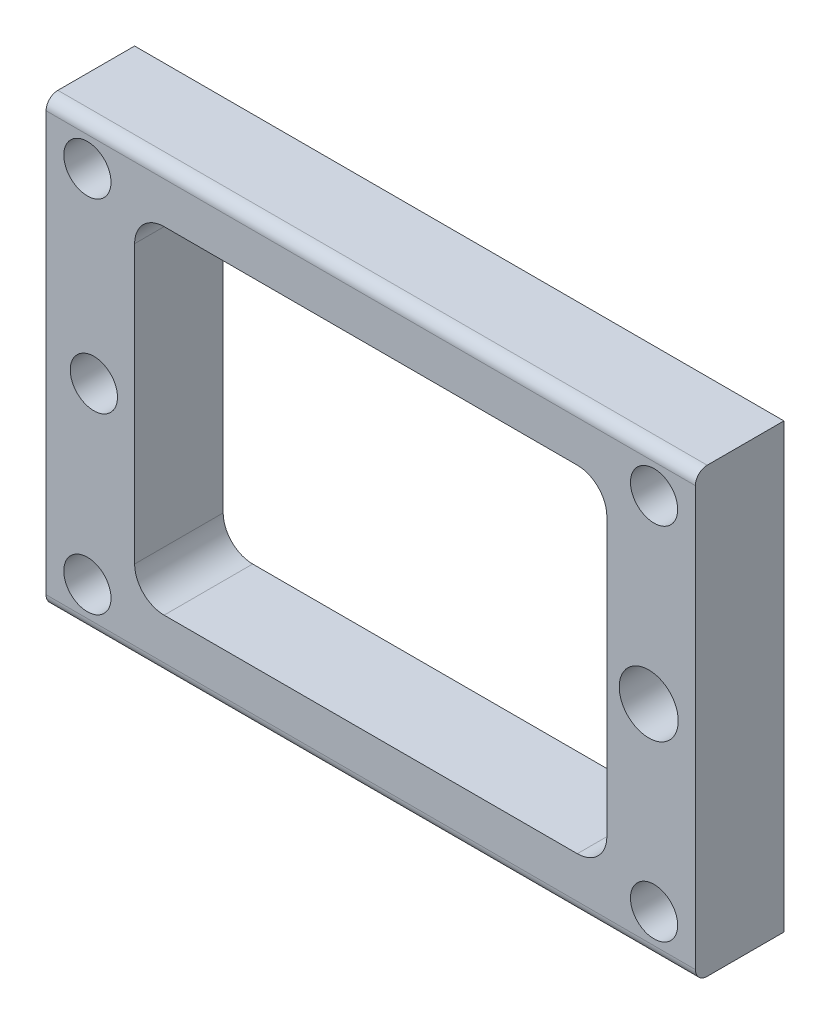
ISO-10303-21;
HEADER;
FILE_DESCRIPTION(('STEP AP214'),'2;1');
FILE_NAME('part.step','',(''),(''),'','','');
FILE_SCHEMA(('AUTOMOTIVE_DESIGN { 1 0 10303 214 1 1 1 1 }'));
ENDSEC;
DATA;
#1=APPLICATION_CONTEXT('core data for automotive mechanical design processes');
#2=APPLICATION_PROTOCOL_DEFINITION('international standard','automotive_design',2000,#1);
#3=PRODUCT_CONTEXT('',#1,'mechanical');
#4=PRODUCT('Part','Part','',(#3));
#5=PRODUCT_RELATED_PRODUCT_CATEGORY('part','',(#4));
#6=PRODUCT_DEFINITION_FORMATION('','',#4);
#7=PRODUCT_DEFINITION_CONTEXT('part definition',#1,'design');
#8=PRODUCT_DEFINITION('design','',#6,#7);
#9=PRODUCT_DEFINITION_SHAPE('','',#8);
#10=(LENGTH_UNIT() NAMED_UNIT(*) SI_UNIT(.MILLI.,.METRE.));
#11=(NAMED_UNIT(*) PLANE_ANGLE_UNIT() SI_UNIT($,.RADIAN.));
#12=(NAMED_UNIT(*) SI_UNIT($,.STERADIAN.) SOLID_ANGLE_UNIT());
#13=UNCERTAINTY_MEASURE_WITH_UNIT(LENGTH_MEASURE(1.E-05),#10,'distance_accuracy_value','');
#14=(GEOMETRIC_REPRESENTATION_CONTEXT(3) GLOBAL_UNCERTAINTY_ASSIGNED_CONTEXT((#13)) GLOBAL_UNIT_ASSIGNED_CONTEXT((#10,
#11,#12)) REPRESENTATION_CONTEXT('',''));
#15=CARTESIAN_POINT('',(0.,0.,0.));
#16=DIRECTION('',(0.,0.,1.));
#17=DIRECTION('',(1.,0.,0.));
#18=AXIS2_PLACEMENT_3D('',#15,#16,#17);
#19=CARTESIAN_POINT('',(-645.862272549346,927.057366956166,15.));
#20=DIRECTION('',(0.,0.,-1.));
#21=DIRECTION('',(-1.,0.,0.));
#22=AXIS2_PLACEMENT_3D('',#19,#20,#21);
#23=CYLINDRICAL_SURFACE('',#22,1.99751610699502);
#24=CARTESIAN_POINT('',(-645.862272549346,927.057366956166,0.));
#25=DIRECTION('',(0.,0.,1.));
#26=DIRECTION('',(1.,0.,0.));
#27=AXIS2_PLACEMENT_3D('',#24,#25,#26);
#28=CIRCLE('',#27,1.99751610699502);
#29=CARTESIAN_POINT('',(-643.864756442351,927.057366956166,0.));
#30=VERTEX_POINT('',#29);
#31=EDGE_CURVE('E223',#30,#30,#28,.T.);
#32=ORIENTED_EDGE('',*,*,#31,.F.);
#33=EDGE_LOOP('',(#32));
#34=FACE_BOUND('',#33,.T.);
#35=CARTESIAN_POINT('',(-645.862272549346,927.057366956166,9.));
#36=DIRECTION('',(0.,0.,1.));
#37=DIRECTION('',(1.,0.,0.));
#38=AXIS2_PLACEMENT_3D('',#35,#36,#37);
#39=CIRCLE('',#38,1.99751610699502);
#40=CARTESIAN_POINT('',(-643.864756442351,927.057366956166,9.));
#41=VERTEX_POINT('',#40);
#42=EDGE_CURVE('E197',#41,#41,#39,.T.);
#43=ORIENTED_EDGE('',*,*,#42,.T.);
#44=EDGE_LOOP('',(#43));
#45=FACE_BOUND('',#44,.T.);
#46=ADVANCED_FACE('F43',(#34,#45),#23,.F.);
#47=CARTESIAN_POINT('',(-741.862272549346,927.057366956166,15.));
#48=DIRECTION('',(0.,0.,-1.));
#49=DIRECTION('',(-1.,0.,0.));
#50=AXIS2_PLACEMENT_3D('',#47,#48,#49);
#51=CYLINDRICAL_SURFACE('',#50,2.);
#52=CARTESIAN_POINT('',(-741.862272549346,927.057366956166,0.));
#53=DIRECTION('',(0.,0.,1.));
#54=DIRECTION('',(1.,0.,0.));
#55=AXIS2_PLACEMENT_3D('',#52,#53,#54);
#56=CIRCLE('',#55,2.);
#57=CARTESIAN_POINT('',(-739.862272549346,927.057366956166,0.));
#58=VERTEX_POINT('',#57);
#59=EDGE_CURVE('E225',#58,#58,#56,.T.);
#60=ORIENTED_EDGE('',*,*,#59,.F.);
#61=EDGE_LOOP('',(#60));
#62=FACE_BOUND('',#61,.T.);
#63=CARTESIAN_POINT('',(-741.862272549346,927.057366956166,9.));
#64=DIRECTION('',(0.,0.,1.));
#65=DIRECTION('',(1.,0.,0.));
#66=AXIS2_PLACEMENT_3D('',#63,#64,#65);
#67=CIRCLE('',#66,2.);
#68=CARTESIAN_POINT('',(-739.862272549346,927.057366956166,9.));
#69=VERTEX_POINT('',#68);
#70=EDGE_CURVE('E270',#69,#69,#67,.T.);
#71=ORIENTED_EDGE('',*,*,#70,.T.);
#72=EDGE_LOOP('',(#71));
#73=FACE_BOUND('',#72,.T.);
#74=ADVANCED_FACE('F312',(#62,#73),#51,.F.);
#75=CARTESIAN_POINT('',(-741.862272549346,866.057366956166,15.));
#76=DIRECTION('',(0.,0.,-1.));
#77=DIRECTION('',(-1.,0.,0.));
#78=AXIS2_PLACEMENT_3D('',#75,#76,#77);
#79=CYLINDRICAL_SURFACE('',#78,2.);
#80=CARTESIAN_POINT('',(-741.862272549346,866.057366956166,0.));
#81=DIRECTION('',(0.,0.,1.));
#82=DIRECTION('',(1.,0.,0.));
#83=AXIS2_PLACEMENT_3D('',#80,#81,#82);
#84=CIRCLE('',#83,2.);
#85=CARTESIAN_POINT('',(-739.862272549346,866.057366956166,0.));
#86=VERTEX_POINT('',#85);
#87=EDGE_CURVE('E218',#86,#86,#84,.T.);
#88=ORIENTED_EDGE('',*,*,#87,.F.);
#89=EDGE_LOOP('',(#88));
#90=FACE_BOUND('',#89,.T.);
#91=CARTESIAN_POINT('',(-741.862272549346,866.057366956166,9.));
#92=DIRECTION('',(0.,0.,1.));
#93=DIRECTION('',(1.,0.,0.));
#94=AXIS2_PLACEMENT_3D('',#91,#92,#93);
#95=CIRCLE('',#94,2.);
#96=CARTESIAN_POINT('',(-739.862272549346,866.057366956166,9.));
#97=VERTEX_POINT('',#96);
#98=EDGE_CURVE('E263',#97,#97,#95,.T.);
#99=ORIENTED_EDGE('',*,*,#98,.T.);
#100=EDGE_LOOP('',(#99));
#101=FACE_BOUND('',#100,.T.);
#102=ADVANCED_FACE('F325',(#90,#101),#79,.F.);
#103=CARTESIAN_POINT('',(-645.862272549346,866.057366956166,15.));
#104=DIRECTION('',(0.,0.,-1.));
#105=DIRECTION('',(-1.,0.,0.));
#106=AXIS2_PLACEMENT_3D('',#103,#104,#105);
#107=CYLINDRICAL_SURFACE('',#106,2.);
#108=CARTESIAN_POINT('',(-645.862272549346,866.057366956166,0.));
#109=DIRECTION('',(0.,0.,1.));
#110=DIRECTION('',(1.,0.,0.));
#111=AXIS2_PLACEMENT_3D('',#108,#109,#110);
#112=CIRCLE('',#111,2.);
#113=CARTESIAN_POINT('',(-643.862272549346,866.057366956166,0.));
#114=VERTEX_POINT('',#113);
#115=EDGE_CURVE('E216',#114,#114,#112,.T.);
#116=ORIENTED_EDGE('',*,*,#115,.F.);
#117=EDGE_LOOP('',(#116));
#118=FACE_BOUND('',#117,.T.);
#119=CARTESIAN_POINT('',(-645.862272549346,866.057366956166,9.));
#120=DIRECTION('',(0.,0.,1.));
#121=DIRECTION('',(1.,0.,0.));
#122=AXIS2_PLACEMENT_3D('',#119,#120,#121);
#123=CIRCLE('',#122,2.);
#124=CARTESIAN_POINT('',(-643.862272549346,866.057366956166,9.));
#125=VERTEX_POINT('',#124);
#126=EDGE_CURVE('E257',#125,#125,#123,.T.);
#127=ORIENTED_EDGE('',*,*,#126,.T.);
#128=EDGE_LOOP('',(#127));
#129=FACE_BOUND('',#128,.T.);
#130=ADVANCED_FACE('F315',(#118,#129),#107,.F.);
#131=CARTESIAN_POINT('',(-748.862272549346,0.,15.));
#132=DIRECTION('',(1.,0.,0.));
#133=DIRECTION('',(0.,0.,-1.));
#134=AXIS2_PLACEMENT_3D('',#131,#132,#133);
#135=PLANE('',#134);
#136=DIRECTION('',(0.,-1.,0.));
#137=VECTOR('',#136,1.);
#138=CARTESIAN_POINT('',(-748.862272549346,0.,15.));
#139=LINE('',#138,#137);
#140=CARTESIAN_POINT('',(-748.862272549346,932.057366956166,15.));
#141=VERTEX_POINT('',#140);
#142=CARTESIAN_POINT('',(-748.862272549346,861.057366956166,15.));
#143=VERTEX_POINT('',#142);
#144=EDGE_CURVE('E188',#141,#143,#139,.T.);
#145=ORIENTED_EDGE('',*,*,#144,.F.);
#146=CARTESIAN_POINT('',(-748.862272549346,932.057366956166,13.));
#147=DIRECTION('',(1.,0.,0.));
#148=DIRECTION('',(0.,0.,-1.));
#149=AXIS2_PLACEMENT_3D('',#146,#147,#148);
#150=CIRCLE('',#149,2.);
#151=CARTESIAN_POINT('',(-748.862272549346,934.057366956166,13.));
#152=VERTEX_POINT('',#151);
#153=EDGE_CURVE('E276',#141,#152,#150,.F.);
#154=ORIENTED_EDGE('',*,*,#153,.T.);
#155=DIRECTION('',(0.,0.,-1.));
#156=VECTOR('',#155,1.);
#157=CARTESIAN_POINT('',(-748.862272549346,934.057366956166,15.));
#158=LINE('',#157,#156);
#159=CARTESIAN_POINT('',(-748.862272549346,934.057366956166,0.));
#160=VERTEX_POINT('',#159);
#161=EDGE_CURVE('E154',#152,#160,#158,.T.);
#162=ORIENTED_EDGE('',*,*,#161,.T.);
#163=DIRECTION('',(0.,-1.,0.));
#164=VECTOR('',#163,1.);
#165=CARTESIAN_POINT('',(-748.862272549346,0.,0.));
#166=LINE('',#165,#164);
#167=CARTESIAN_POINT('',(-748.862272549346,859.057366956166,0.));
#168=VERTEX_POINT('',#167);
#169=EDGE_CURVE('E228',#160,#168,#166,.T.);
#170=ORIENTED_EDGE('',*,*,#169,.T.);
#171=DIRECTION('',(0.,0.,-1.));
#172=VECTOR('',#171,1.);
#173=CARTESIAN_POINT('',(-748.862272549346,859.057366956166,15.));
#174=LINE('',#173,#172);
#175=CARTESIAN_POINT('',(-748.862272549346,859.057366956166,13.));
#176=VERTEX_POINT('',#175);
#177=EDGE_CURVE('E244',#176,#168,#174,.T.);
#178=ORIENTED_EDGE('',*,*,#177,.F.);
#179=CARTESIAN_POINT('',(-748.862272549346,861.057366956166,13.));
#180=DIRECTION('',(1.,0.,0.));
#181=DIRECTION('',(0.,0.,-1.));
#182=AXIS2_PLACEMENT_3D('',#179,#180,#181);
#183=CIRCLE('',#182,2.);
#184=EDGE_CURVE('E280',#176,#143,#183,.F.);
#185=ORIENTED_EDGE('',*,*,#184,.T.);
#186=EDGE_LOOP('',(#145,#154,#162,#170,#178,#185));
#187=FACE_BOUND('',#186,.T.);
#188=ADVANCED_FACE('F292',(#187),#135,.F.);
#189=CARTESIAN_POINT('',(0.,859.057366956166,15.));
#190=DIRECTION('',(0.,1.,0.));
#191=DIRECTION('',(0.,0.,1.));
#192=AXIS2_PLACEMENT_3D('',#189,#190,#191);
#193=PLANE('',#192);
#194=DIRECTION('',(0.,0.,-1.));
#195=VECTOR('',#194,1.);
#196=CARTESIAN_POINT('',(-638.862272549346,859.057366956166,15.));
#197=LINE('',#196,#195);
#198=CARTESIAN_POINT('',(-638.862272549346,859.057366956166,13.));
#199=VERTEX_POINT('',#198);
#200=CARTESIAN_POINT('',(-638.862272549346,859.057366956166,0.));
#201=VERTEX_POINT('',#200);
#202=EDGE_CURVE('E245',#199,#201,#197,.T.);
#203=ORIENTED_EDGE('',*,*,#202,.F.);
#204=DIRECTION('',(1.,0.,0.));
#205=VECTOR('',#204,1.);
#206=CARTESIAN_POINT('',(-748.862272549346,859.057366956166,13.));
#207=LINE('',#206,#205);
#208=EDGE_CURVE('E11',#199,#176,#207,.F.);
#209=ORIENTED_EDGE('',*,*,#208,.T.);
#210=ORIENTED_EDGE('',*,*,#177,.T.);
#211=DIRECTION('',(1.,0.,0.));
#212=VECTOR('',#211,1.);
#213=CARTESIAN_POINT('',(0.,859.057366956166,0.));
#214=LINE('',#213,#212);
#215=EDGE_CURVE('E232',#168,#201,#214,.T.);
#216=ORIENTED_EDGE('',*,*,#215,.T.);
#217=EDGE_LOOP('',(#203,#209,#210,#216));
#218=FACE_BOUND('',#217,.T.);
#219=ADVANCED_FACE('F304',(#218),#193,.F.);
#220=CARTESIAN_POINT('',(-638.862272549346,0.,15.));
#221=DIRECTION('',(-1.,0.,0.));
#222=DIRECTION('',(0.,0.,1.));
#223=AXIS2_PLACEMENT_3D('',#220,#221,#222);
#224=PLANE('',#223);
#225=DIRECTION('',(0.,0.,-1.));
#226=VECTOR('',#225,1.);
#227=CARTESIAN_POINT('',(-638.862272549346,934.057366956166,15.));
#228=LINE('',#227,#226);
#229=CARTESIAN_POINT('',(-638.862272549346,934.057366956166,13.));
#230=VERTEX_POINT('',#229);
#231=CARTESIAN_POINT('',(-638.862272549346,934.057366956166,0.));
#232=VERTEX_POINT('',#231);
#233=EDGE_CURVE('E238',#230,#232,#228,.T.);
#234=ORIENTED_EDGE('',*,*,#233,.F.);
#235=CARTESIAN_POINT('',(-638.862272549346,932.057366956166,13.));
#236=DIRECTION('',(-1.,0.,0.));
#237=DIRECTION('',(0.,0.,1.));
#238=AXIS2_PLACEMENT_3D('',#235,#236,#237);
#239=CIRCLE('',#238,2.);
#240=CARTESIAN_POINT('',(-638.862272549346,932.057366956166,15.));
#241=VERTEX_POINT('',#240);
#242=EDGE_CURVE('E51',#230,#241,#239,.F.);
#243=ORIENTED_EDGE('',*,*,#242,.T.);
#244=DIRECTION('',(0.,1.,0.));
#245=VECTOR('',#244,1.);
#246=CARTESIAN_POINT('',(-638.862272549346,0.,15.));
#247=LINE('',#246,#245);
#248=CARTESIAN_POINT('',(-638.862272549346,861.057366956166,15.));
#249=VERTEX_POINT('',#248);
#250=EDGE_CURVE('E192',#249,#241,#247,.T.);
#251=ORIENTED_EDGE('',*,*,#250,.F.);
#252=CARTESIAN_POINT('',(-638.862272549346,861.057366956166,13.));
#253=DIRECTION('',(-1.,0.,0.));
#254=DIRECTION('',(0.,0.,1.));
#255=AXIS2_PLACEMENT_3D('',#252,#253,#254);
#256=CIRCLE('',#255,2.);
#257=EDGE_CURVE('E59',#249,#199,#256,.F.);
#258=ORIENTED_EDGE('',*,*,#257,.T.);
#259=ORIENTED_EDGE('',*,*,#202,.T.);
#260=DIRECTION('',(0.,1.,0.));
#261=VECTOR('',#260,1.);
#262=CARTESIAN_POINT('',(-638.862272549346,0.,0.));
#263=LINE('',#262,#261);
#264=EDGE_CURVE('E234',#201,#232,#263,.T.);
#265=ORIENTED_EDGE('',*,*,#264,.T.);
#266=EDGE_LOOP('',(#234,#243,#251,#258,#259,#265));
#267=FACE_BOUND('',#266,.T.);
#268=ADVANCED_FACE('F283',(#267),#224,.F.);
#269=CARTESIAN_POINT('',(-728.862272549346,920.057366956166,15.));
#270=DIRECTION('',(0.,0.,-1.));
#271=DIRECTION('',(-1.,0.,0.));
#272=AXIS2_PLACEMENT_3D('',#269,#270,#271);
#273=CYLINDRICAL_SURFACE('',#272,5.);
#274=CARTESIAN_POINT('',(-728.862272549346,920.057366956166,0.));
#275=DIRECTION('',(0.,0.,1.));
#276=DIRECTION('',(1.,0.,0.));
#277=AXIS2_PLACEMENT_3D('',#274,#275,#276);
#278=CIRCLE('',#277,5.);
#279=CARTESIAN_POINT('',(-728.862272549346,925.057366956166,0.));
#280=VERTEX_POINT('',#279);
#281=CARTESIAN_POINT('',(-733.862272549346,920.057366956166,0.));
#282=VERTEX_POINT('',#281);
#283=EDGE_CURVE('E147',#280,#282,#278,.T.);
#284=ORIENTED_EDGE('',*,*,#283,.F.);
#285=DIRECTION('',(0.,0.,-1.));
#286=VECTOR('',#285,1.);
#287=CARTESIAN_POINT('',(-728.862272549346,925.057366956166,15.));
#288=LINE('',#287,#286);
#289=CARTESIAN_POINT('',(-728.862272549346,925.057366956166,15.));
#290=VERTEX_POINT('',#289);
#291=EDGE_CURVE('E145',#290,#280,#288,.T.);
#292=ORIENTED_EDGE('',*,*,#291,.F.);
#293=CARTESIAN_POINT('',(-728.862272549346,920.057366956166,15.));
#294=DIRECTION('',(0.,0.,1.));
#295=DIRECTION('',(1.,0.,0.));
#296=AXIS2_PLACEMENT_3D('',#293,#294,#295);
#297=CIRCLE('',#296,5.);
#298=CARTESIAN_POINT('',(-733.862272549346,920.057366956166,15.));
#299=VERTEX_POINT('',#298);
#300=EDGE_CURVE('E150',#290,#299,#297,.T.);
#301=ORIENTED_EDGE('',*,*,#300,.T.);
#302=DIRECTION('',(0.,0.,-1.));
#303=VECTOR('',#302,1.);
#304=CARTESIAN_POINT('',(-733.862272549346,920.057366956166,15.));
#305=LINE('',#304,#303);
#306=EDGE_CURVE('E194',#299,#282,#305,.T.);
#307=ORIENTED_EDGE('',*,*,#306,.T.);
#308=EDGE_LOOP('',(#284,#292,#301,#307));
#309=FACE_BOUND('',#308,.T.);
#310=ADVANCED_FACE('F148',(#309),#273,.F.);
#311=CARTESIAN_POINT('',(-4.56453327952828E-12,925.057366956169,15.));
#312=DIRECTION('',(0.,-1.,0.));
#313=DIRECTION('',(1.,0.,0.));
#314=AXIS2_PLACEMENT_3D('',#311,#312,#313);
#315=PLANE('',#314);
#316=DIRECTION('',(-1.,0.,0.));
#317=VECTOR('',#316,1.);
#318=CARTESIAN_POINT('',(-4.56453327952828E-12,925.057366956169,0.));
#319=LINE('',#318,#317);
#320=CARTESIAN_POINT('',(-658.862272549346,925.057366956166,0.));
#321=VERTEX_POINT('',#320);
#322=EDGE_CURVE('E198',#321,#280,#319,.T.);
#323=ORIENTED_EDGE('',*,*,#322,.F.);
#324=DIRECTION('',(0.,0.,-1.));
#325=VECTOR('',#324,1.);
#326=CARTESIAN_POINT('',(-658.862272549346,925.057366956166,15.));
#327=LINE('',#326,#325);
#328=CARTESIAN_POINT('',(-658.862272549346,925.057366956166,15.));
#329=VERTEX_POINT('',#328);
#330=EDGE_CURVE('E156',#329,#321,#327,.T.);
#331=ORIENTED_EDGE('',*,*,#330,.F.);
#332=DIRECTION('',(-1.,0.,0.));
#333=VECTOR('',#332,1.);
#334=CARTESIAN_POINT('',(-4.56453327952828E-12,925.057366956169,15.));
#335=LINE('',#334,#333);
#336=EDGE_CURVE('E163',#329,#290,#335,.T.);
#337=ORIENTED_EDGE('',*,*,#336,.T.);
#338=ORIENTED_EDGE('',*,*,#291,.T.);
#339=EDGE_LOOP('',(#323,#331,#337,#338));
#340=FACE_BOUND('',#339,.T.);
#341=ADVANCED_FACE('F166',(#340),#315,.T.);
#342=CARTESIAN_POINT('',(-658.862272549346,920.057366956166,15.));
#343=DIRECTION('',(0.,0.,-1.));
#344=DIRECTION('',(-1.,0.,0.));
#345=AXIS2_PLACEMENT_3D('',#342,#343,#344);
#346=CYLINDRICAL_SURFACE('',#345,5.);
#347=CARTESIAN_POINT('',(-658.862272549346,920.057366956166,0.));
#348=DIRECTION('',(0.,0.,1.));
#349=DIRECTION('',(1.,0.,0.));
#350=AXIS2_PLACEMENT_3D('',#347,#348,#349);
#351=CIRCLE('',#350,5.);
#352=CARTESIAN_POINT('',(-653.862272549346,920.057366956166,0.));
#353=VERTEX_POINT('',#352);
#354=EDGE_CURVE('E200',#353,#321,#351,.T.);
#355=ORIENTED_EDGE('',*,*,#354,.F.);
#356=DIRECTION('',(0.,0.,-1.));
#357=VECTOR('',#356,1.);
#358=CARTESIAN_POINT('',(-653.862272549346,920.057366956166,15.));
#359=LINE('',#358,#357);
#360=CARTESIAN_POINT('',(-653.862272549346,920.057366956166,15.));
#361=VERTEX_POINT('',#360);
#362=EDGE_CURVE('E260',#361,#353,#359,.T.);
#363=ORIENTED_EDGE('',*,*,#362,.F.);
#364=CARTESIAN_POINT('',(-658.862272549346,920.057366956166,15.));
#365=DIRECTION('',(0.,0.,1.));
#366=DIRECTION('',(1.,0.,0.));
#367=AXIS2_PLACEMENT_3D('',#364,#365,#366);
#368=CIRCLE('',#367,5.);
#369=EDGE_CURVE('E168',#361,#329,#368,.T.);
#370=ORIENTED_EDGE('',*,*,#369,.T.);
#371=ORIENTED_EDGE('',*,*,#330,.T.);
#372=EDGE_LOOP('',(#355,#363,#370,#371));
#373=FACE_BOUND('',#372,.T.);
#374=ADVANCED_FACE('F355',(#373),#346,.F.);
#375=CARTESIAN_POINT('',(-653.862272549343,-1.54453819131492E-12,15.));
#376=DIRECTION('',(-1.,0.,0.));
#377=DIRECTION('',(0.,-1.,0.));
#378=AXIS2_PLACEMENT_3D('',#375,#376,#377);
#379=PLANE('',#378);
#380=DIRECTION('',(0.,1.,0.));
#381=VECTOR('',#380,1.);
#382=CARTESIAN_POINT('',(-653.862272549343,-1.54453819131492E-12,0.));
#383=LINE('',#382,#381);
#384=CARTESIAN_POINT('',(-653.862272549345,873.057366956166,0.));
#385=VERTEX_POINT('',#384);
#386=EDGE_CURVE('E205',#385,#353,#383,.T.);
#387=ORIENTED_EDGE('',*,*,#386,.F.);
#388=DIRECTION('',(0.,0.,-1.));
#389=VECTOR('',#388,1.);
#390=CARTESIAN_POINT('',(-653.862272549345,873.057366956166,15.));
#391=LINE('',#390,#389);
#392=CARTESIAN_POINT('',(-653.862272549345,873.057366956166,15.));
#393=VERTEX_POINT('',#392);
#394=EDGE_CURVE('E254',#393,#385,#391,.T.);
#395=ORIENTED_EDGE('',*,*,#394,.F.);
#396=DIRECTION('',(0.,1.,0.));
#397=VECTOR('',#396,1.);
#398=CARTESIAN_POINT('',(-653.862272549343,-1.54453819131492E-12,15.));
#399=LINE('',#398,#397);
#400=EDGE_CURVE('E175',#393,#361,#399,.T.);
#401=ORIENTED_EDGE('',*,*,#400,.T.);
#402=ORIENTED_EDGE('',*,*,#362,.T.);
#403=EDGE_LOOP('',(#387,#395,#401,#402));
#404=FACE_BOUND('',#403,.T.);
#405=ADVANCED_FACE('F346',(#404),#379,.T.);
#406=CARTESIAN_POINT('',(-658.862272549345,873.057366956166,15.));
#407=DIRECTION('',(0.,0.,-1.));
#408=DIRECTION('',(-1.,0.,0.));
#409=AXIS2_PLACEMENT_3D('',#406,#407,#408);
#410=CYLINDRICAL_SURFACE('',#409,5.00000000000006);
#411=CARTESIAN_POINT('',(-658.862272549345,873.057366956166,0.));
#412=DIRECTION('',(0.,0.,1.));
#413=DIRECTION('',(1.,0.,0.));
#414=AXIS2_PLACEMENT_3D('',#411,#412,#413);
#415=CIRCLE('',#414,5.00000000000006);
#416=CARTESIAN_POINT('',(-658.862272549345,868.057366956166,0.));
#417=VERTEX_POINT('',#416);
#418=EDGE_CURVE('E202',#417,#385,#415,.T.);
#419=ORIENTED_EDGE('',*,*,#418,.F.);
#420=DIRECTION('',(0.,0.,-1.));
#421=VECTOR('',#420,1.);
#422=CARTESIAN_POINT('',(-658.862272549345,868.057366956166,15.));
#423=LINE('',#422,#421);
#424=CARTESIAN_POINT('',(-658.862272549345,868.057366956166,15.));
#425=VERTEX_POINT('',#424);
#426=EDGE_CURVE('E251',#425,#417,#423,.T.);
#427=ORIENTED_EDGE('',*,*,#426,.F.);
#428=CARTESIAN_POINT('',(-658.862272549345,873.057366956166,15.));
#429=DIRECTION('',(0.,0.,1.));
#430=DIRECTION('',(1.,0.,0.));
#431=AXIS2_PLACEMENT_3D('',#428,#429,#430);
#432=CIRCLE('',#431,5.00000000000006);
#433=EDGE_CURVE('E178',#425,#393,#432,.T.);
#434=ORIENTED_EDGE('',*,*,#433,.T.);
#435=ORIENTED_EDGE('',*,*,#394,.T.);
#436=EDGE_LOOP('',(#419,#427,#434,#435));
#437=FACE_BOUND('',#436,.T.);
#438=ADVANCED_FACE('F344',(#437),#410,.F.);
#439=CARTESIAN_POINT('',(0.,868.057366956166,15.));
#440=DIRECTION('',(0.,1.,0.));
#441=DIRECTION('',(0.,0.,1.));
#442=AXIS2_PLACEMENT_3D('',#439,#440,#441);
#443=PLANE('',#442);
#444=DIRECTION('',(1.,0.,0.));
#445=VECTOR('',#444,1.);
#446=CARTESIAN_POINT('',(0.,868.057366956166,0.));
#447=LINE('',#446,#445);
#448=CARTESIAN_POINT('',(-728.862272549345,868.057366956166,0.));
#449=VERTEX_POINT('',#448);
#450=EDGE_CURVE('E208',#449,#417,#447,.T.);
#451=ORIENTED_EDGE('',*,*,#450,.F.);
#452=DIRECTION('',(0.,0.,-1.));
#453=VECTOR('',#452,1.);
#454=CARTESIAN_POINT('',(-728.862272549345,868.057366956166,15.));
#455=LINE('',#454,#453);
#456=CARTESIAN_POINT('',(-728.862272549345,868.057366956166,15.));
#457=VERTEX_POINT('',#456);
#458=EDGE_CURVE('E253',#457,#449,#455,.T.);
#459=ORIENTED_EDGE('',*,*,#458,.F.);
#460=DIRECTION('',(1.,0.,0.));
#461=VECTOR('',#460,1.);
#462=CARTESIAN_POINT('',(0.,868.057366956166,15.));
#463=LINE('',#462,#461);
#464=EDGE_CURVE('E182',#457,#425,#463,.T.);
#465=ORIENTED_EDGE('',*,*,#464,.T.);
#466=ORIENTED_EDGE('',*,*,#426,.T.);
#467=EDGE_LOOP('',(#451,#459,#465,#466));
#468=FACE_BOUND('',#467,.T.);
#469=ADVANCED_FACE('F336',(#468),#443,.T.);
#470=CARTESIAN_POINT('',(-728.862272549345,873.057366956166,15.));
#471=DIRECTION('',(0.,0.,-1.));
#472=DIRECTION('',(-1.,0.,0.));
#473=AXIS2_PLACEMENT_3D('',#470,#471,#472);
#474=CYLINDRICAL_SURFACE('',#473,5.);
#475=CARTESIAN_POINT('',(-728.862272549345,873.057366956166,0.));
#476=DIRECTION('',(0.,0.,1.));
#477=DIRECTION('',(1.,0.,0.));
#478=AXIS2_PLACEMENT_3D('',#475,#476,#477);
#479=CIRCLE('',#478,5.);
#480=CARTESIAN_POINT('',(-733.862272549345,873.057366956166,0.));
#481=VERTEX_POINT('',#480);
#482=EDGE_CURVE('E211',#481,#449,#479,.T.);
#483=ORIENTED_EDGE('',*,*,#482,.F.);
#484=DIRECTION('',(0.,0.,-1.));
#485=VECTOR('',#484,1.);
#486=CARTESIAN_POINT('',(-733.862272549345,873.057366956166,15.));
#487=LINE('',#486,#485);
#488=CARTESIAN_POINT('',(-733.862272549345,873.057366956166,15.));
#489=VERTEX_POINT('',#488);
#490=EDGE_CURVE('E248',#489,#481,#487,.T.);
#491=ORIENTED_EDGE('',*,*,#490,.F.);
#492=CARTESIAN_POINT('',(-728.862272549345,873.057366956166,15.));
#493=DIRECTION('',(0.,0.,1.));
#494=DIRECTION('',(1.,0.,0.));
#495=AXIS2_PLACEMENT_3D('',#492,#493,#494);
#496=CIRCLE('',#495,5.);
#497=EDGE_CURVE('E184',#489,#457,#496,.T.);
#498=ORIENTED_EDGE('',*,*,#497,.T.);
#499=ORIENTED_EDGE('',*,*,#458,.T.);
#500=EDGE_LOOP('',(#483,#491,#498,#499));
#501=FACE_BOUND('',#500,.T.);
#502=ADVANCED_FACE('F340',(#501),#474,.F.);
#503=CARTESIAN_POINT('',(-733.862272549343,-1.73351232316601E-12,15.));
#504=DIRECTION('',(1.,0.,0.));
#505=DIRECTION('',(0.,1.,0.));
#506=AXIS2_PLACEMENT_3D('',#503,#504,#505);
#507=PLANE('',#506);
#508=ORIENTED_EDGE('',*,*,#490,.T.);
#509=DIRECTION('',(0.,-1.,0.));
#510=VECTOR('',#509,1.);
#511=CARTESIAN_POINT('',(-733.862272549343,-1.73351232316601E-12,0.));
#512=LINE('',#511,#510);
#513=EDGE_CURVE('E212',#282,#481,#512,.T.);
#514=ORIENTED_EDGE('',*,*,#513,.F.);
#515=ORIENTED_EDGE('',*,*,#306,.F.);
#516=DIRECTION('',(0.,-1.,0.));
#517=VECTOR('',#516,1.);
#518=CARTESIAN_POINT('',(-733.862272549343,-1.73351232316601E-12,15.));
#519=LINE('',#518,#517);
#520=EDGE_CURVE('E167',#299,#489,#519,.T.);
#521=ORIENTED_EDGE('',*,*,#520,.T.);
#522=EDGE_LOOP('',(#508,#514,#515,#521));
#523=FACE_BOUND('',#522,.T.);
#524=ADVANCED_FACE('F331',(#523),#507,.T.);
#525=CARTESIAN_POINT('',(0.,934.057366956166,15.));
#526=DIRECTION('',(0.,-1.,0.));
#527=DIRECTION('',(0.,0.,-1.));
#528=AXIS2_PLACEMENT_3D('',#525,#526,#527);
#529=PLANE('',#528);
#530=ORIENTED_EDGE('',*,*,#161,.F.);
#531=DIRECTION('',(-1.,0.,0.));
#532=VECTOR('',#531,1.);
#533=CARTESIAN_POINT('',(-638.862272549346,934.057366956166,13.));
#534=LINE('',#533,#532);
#535=EDGE_CURVE('E67',#152,#230,#534,.F.);
#536=ORIENTED_EDGE('',*,*,#535,.T.);
#537=ORIENTED_EDGE('',*,*,#233,.T.);
#538=DIRECTION('',(-1.,0.,0.));
#539=VECTOR('',#538,1.);
#540=CARTESIAN_POINT('',(0.,934.057366956166,0.));
#541=LINE('',#540,#539);
#542=EDGE_CURVE('E170',#232,#160,#541,.T.);
#543=ORIENTED_EDGE('',*,*,#542,.T.);
#544=EDGE_LOOP('',(#530,#536,#537,#543));
#545=FACE_BOUND('',#544,.T.);
#546=ADVANCED_FACE('F295',(#545),#529,.F.);
#547=CARTESIAN_POINT('',(0.,0.,15.));
#548=DIRECTION('',(0.,0.,1.));
#549=DIRECTION('',(1.,0.,0.));
#550=AXIS2_PLACEMENT_3D('',#547,#548,#549);
#551=PLANE('',#550);
#552=CARTESIAN_POINT('',(-740.766439287888,896.084665270984,15.));
#553=DIRECTION('',(0.,0.,1.));
#554=DIRECTION('',(1.,0.,0.));
#555=AXIS2_PLACEMENT_3D('',#552,#553,#554);
#556=CIRCLE('',#555,3.99999999999999);
#557=CARTESIAN_POINT('',(-736.766439287888,896.084665270984,15.));
#558=VERTEX_POINT('',#557);
#559=EDGE_CURVE('E572',#558,#558,#556,.T.);
#560=ORIENTED_EDGE('',*,*,#559,.F.);
#561=EDGE_LOOP('',(#560));
#562=FACE_BOUND('',#561,.T.);
#563=CARTESIAN_POINT('',(-646.766439287888,896.084665270984,15.));
#564=DIRECTION('',(0.,0.,1.));
#565=DIRECTION('',(1.,0.,0.));
#566=AXIS2_PLACEMENT_3D('',#563,#564,#565);
#567=CIRCLE('',#566,5.00000000000005);
#568=CARTESIAN_POINT('',(-641.766439287888,896.084665270984,15.));
#569=VERTEX_POINT('',#568);
#570=EDGE_CURVE('E566',#569,#569,#567,.T.);
#571=ORIENTED_EDGE('',*,*,#570,.F.);
#572=EDGE_LOOP('',(#571));
#573=FACE_BOUND('',#572,.T.);
#574=ORIENTED_EDGE('',*,*,#497,.F.);
#575=ORIENTED_EDGE('',*,*,#520,.F.);
#576=ORIENTED_EDGE('',*,*,#300,.F.);
#577=ORIENTED_EDGE('',*,*,#336,.F.);
#578=ORIENTED_EDGE('',*,*,#369,.F.);
#579=ORIENTED_EDGE('',*,*,#400,.F.);
#580=ORIENTED_EDGE('',*,*,#433,.F.);
#581=ORIENTED_EDGE('',*,*,#464,.F.);
#582=EDGE_LOOP('',(#574,#575,#576,#577,#578,#579,#580,#581));
#583=FACE_BOUND('',#582,.T.);
#584=CARTESIAN_POINT('',(-741.862272549346,927.057366956166,15.));
#585=DIRECTION('',(0.,0.,1.));
#586=DIRECTION('',(1.,0.,0.));
#587=AXIS2_PLACEMENT_3D('',#584,#585,#586);
#588=CIRCLE('',#587,3.99999999999999);
#589=CARTESIAN_POINT('',(-737.862272549346,927.057366956166,15.));
#590=VERTEX_POINT('',#589);
#591=EDGE_CURVE('E543',#590,#590,#588,.T.);
#592=ORIENTED_EDGE('',*,*,#591,.F.);
#593=EDGE_LOOP('',(#592));
#594=FACE_BOUND('',#593,.T.);
#595=CARTESIAN_POINT('',(-741.862272549346,866.057366956166,15.));
#596=DIRECTION('',(0.,0.,1.));
#597=DIRECTION('',(1.,0.,0.));
#598=AXIS2_PLACEMENT_3D('',#595,#596,#597);
#599=CIRCLE('',#598,3.99999999999999);
#600=CARTESIAN_POINT('',(-737.862272549346,866.057366956166,15.));
#601=VERTEX_POINT('',#600);
#602=EDGE_CURVE('E545',#601,#601,#599,.T.);
#603=ORIENTED_EDGE('',*,*,#602,.F.);
#604=EDGE_LOOP('',(#603));
#605=FACE_BOUND('',#604,.T.);
#606=CARTESIAN_POINT('',(-645.862272549346,866.057366956166,15.));
#607=DIRECTION('',(0.,0.,1.));
#608=DIRECTION('',(1.,0.,0.));
#609=AXIS2_PLACEMENT_3D('',#606,#607,#608);
#610=CIRCLE('',#609,3.99999999999999);
#611=CARTESIAN_POINT('',(-641.862272549346,866.057366956166,15.));
#612=VERTEX_POINT('',#611);
#613=EDGE_CURVE('E559',#612,#612,#610,.T.);
#614=ORIENTED_EDGE('',*,*,#613,.F.);
#615=EDGE_LOOP('',(#614));
#616=FACE_BOUND('',#615,.T.);
#617=CARTESIAN_POINT('',(-645.862272549346,927.057366956166,15.));
#618=DIRECTION('',(0.,0.,1.));
#619=DIRECTION('',(1.,0.,0.));
#620=AXIS2_PLACEMENT_3D('',#617,#618,#619);
#621=CIRCLE('',#620,3.99999999999999);
#622=CARTESIAN_POINT('',(-641.862272549346,927.057366956166,15.));
#623=VERTEX_POINT('',#622);
#624=EDGE_CURVE('E560',#623,#623,#621,.T.);
#625=ORIENTED_EDGE('',*,*,#624,.F.);
#626=EDGE_LOOP('',(#625));
#627=FACE_BOUND('',#626,.T.);
#628=ORIENTED_EDGE('',*,*,#250,.T.);
#629=DIRECTION('',(-1.,0.,0.));
#630=VECTOR('',#629,1.);
#631=CARTESIAN_POINT('',(-748.862272549346,932.057366956166,15.));
#632=LINE('',#631,#630);
#633=EDGE_CURVE('E273',#241,#141,#632,.T.);
#634=ORIENTED_EDGE('',*,*,#633,.T.);
#635=ORIENTED_EDGE('',*,*,#144,.T.);
#636=DIRECTION('',(1.,0.,0.));
#637=VECTOR('',#636,1.);
#638=CARTESIAN_POINT('',(-638.862272549346,861.057366956166,15.));
#639=LINE('',#638,#637);
#640=EDGE_CURVE('E247',#143,#249,#639,.T.);
#641=ORIENTED_EDGE('',*,*,#640,.T.);
#642=EDGE_LOOP('',(#628,#634,#635,#641));
#643=FACE_BOUND('',#642,.T.);
#644=ADVANCED_FACE('F161',(#562,#573,#583,#594,#605,#616,#627,#643),#551,.T.);
#645=CARTESIAN_POINT('',(0.,0.,0.));
#646=DIRECTION('',(0.,0.,1.));
#647=DIRECTION('',(1.,0.,0.));
#648=AXIS2_PLACEMENT_3D('',#645,#646,#647);
#649=PLANE('',#648);
#650=CARTESIAN_POINT('',(-740.766439287888,896.084665270984,0.));
#651=DIRECTION('',(0.,0.,1.));
#652=DIRECTION('',(1.,0.,0.));
#653=AXIS2_PLACEMENT_3D('',#650,#651,#652);
#654=CIRCLE('',#653,3.99999999999999);
#655=CARTESIAN_POINT('',(-736.766439287888,896.084665270984,0.));
#656=VERTEX_POINT('',#655);
#657=EDGE_CURVE('E553',#656,#656,#654,.F.);
#658=ORIENTED_EDGE('',*,*,#657,.F.);
#659=EDGE_LOOP('',(#658));
#660=FACE_BOUND('',#659,.T.);
#661=CARTESIAN_POINT('',(-646.766439287888,896.084665270984,0.));
#662=DIRECTION('',(0.,0.,1.));
#663=DIRECTION('',(1.,0.,0.));
#664=AXIS2_PLACEMENT_3D('',#661,#662,#663);
#665=CIRCLE('',#664,5.00000000000005);
#666=CARTESIAN_POINT('',(-641.766439287888,896.084665270984,0.));
#667=VERTEX_POINT('',#666);
#668=EDGE_CURVE('E575',#667,#667,#665,.F.);
#669=ORIENTED_EDGE('',*,*,#668,.F.);
#670=EDGE_LOOP('',(#669));
#671=FACE_BOUND('',#670,.T.);
#672=ORIENTED_EDGE('',*,*,#513,.T.);
#673=ORIENTED_EDGE('',*,*,#482,.T.);
#674=ORIENTED_EDGE('',*,*,#450,.T.);
#675=ORIENTED_EDGE('',*,*,#418,.T.);
#676=ORIENTED_EDGE('',*,*,#386,.T.);
#677=ORIENTED_EDGE('',*,*,#354,.T.);
#678=ORIENTED_EDGE('',*,*,#322,.T.);
#679=ORIENTED_EDGE('',*,*,#283,.T.);
#680=EDGE_LOOP('',(#672,#673,#674,#675,#676,#677,#678,#679));
#681=FACE_BOUND('',#680,.T.);
#682=ORIENTED_EDGE('',*,*,#115,.T.);
#683=EDGE_LOOP('',(#682));
#684=FACE_BOUND('',#683,.T.);
#685=ORIENTED_EDGE('',*,*,#87,.T.);
#686=EDGE_LOOP('',(#685));
#687=FACE_BOUND('',#686,.T.);
#688=ORIENTED_EDGE('',*,*,#59,.T.);
#689=EDGE_LOOP('',(#688));
#690=FACE_BOUND('',#689,.T.);
#691=ORIENTED_EDGE('',*,*,#31,.T.);
#692=EDGE_LOOP('',(#691));
#693=FACE_BOUND('',#692,.T.);
#694=ORIENTED_EDGE('',*,*,#169,.F.);
#695=ORIENTED_EDGE('',*,*,#542,.F.);
#696=ORIENTED_EDGE('',*,*,#264,.F.);
#697=ORIENTED_EDGE('',*,*,#215,.F.);
#698=EDGE_LOOP('',(#694,#695,#696,#697));
#699=FACE_BOUND('',#698,.T.);
#700=ADVANCED_FACE('F298',(#660,#671,#681,#684,#687,#690,#693,#699),#649,.F.);
#701=CARTESIAN_POINT('',(-645.862272549346,927.057366956166,9.));
#702=DIRECTION('',(0.,0.,1.));
#703=DIRECTION('',(1.,0.,0.));
#704=AXIS2_PLACEMENT_3D('',#701,#702,#703);
#705=CYLINDRICAL_SURFACE('',#704,3.99999999999999);
#706=CARTESIAN_POINT('',(-645.862272549346,927.057366956166,9.));
#707=DIRECTION('',(0.,0.,1.));
#708=DIRECTION('',(1.,0.,0.));
#709=AXIS2_PLACEMENT_3D('',#706,#707,#708);
#710=CIRCLE('',#709,3.99999999999999);
#711=CARTESIAN_POINT('',(-641.862272549346,927.057366956166,9.));
#712=VERTEX_POINT('',#711);
#713=EDGE_CURVE('E262',#712,#712,#710,.T.);
#714=ORIENTED_EDGE('',*,*,#713,.F.);
#715=EDGE_LOOP('',(#714));
#716=FACE_BOUND('',#715,.T.);
#717=ORIENTED_EDGE('',*,*,#624,.T.);
#718=EDGE_LOOP('',(#717));
#719=FACE_BOUND('',#718,.T.);
#720=ADVANCED_FACE('F384',(#716,#719),#705,.F.);
#721=CARTESIAN_POINT('',(-645.862272549346,927.057366956166,9.));
#722=DIRECTION('',(0.,0.,1.));
#723=DIRECTION('',(1.,0.,0.));
#724=AXIS2_PLACEMENT_3D('',#721,#722,#723);
#725=PLANE('',#724);
#726=ORIENTED_EDGE('',*,*,#42,.F.);
#727=EDGE_LOOP('',(#726));
#728=FACE_BOUND('',#727,.T.);
#729=ORIENTED_EDGE('',*,*,#713,.T.);
#730=EDGE_LOOP('',(#729));
#731=FACE_BOUND('',#730,.T.);
#732=ADVANCED_FACE('F381',(#728,#731),#725,.T.);
#733=CARTESIAN_POINT('',(-645.862272549346,866.057366956166,9.));
#734=DIRECTION('',(0.,0.,1.));
#735=DIRECTION('',(1.,0.,0.));
#736=AXIS2_PLACEMENT_3D('',#733,#734,#735);
#737=CYLINDRICAL_SURFACE('',#736,3.99999999999999);
#738=CARTESIAN_POINT('',(-645.862272549346,866.057366956166,9.));
#739=DIRECTION('',(0.,0.,1.));
#740=DIRECTION('',(1.,0.,0.));
#741=AXIS2_PLACEMENT_3D('',#738,#739,#740);
#742=CIRCLE('',#741,3.99999999999999);
#743=CARTESIAN_POINT('',(-641.862272549346,866.057366956166,9.));
#744=VERTEX_POINT('',#743);
#745=EDGE_CURVE('E546',#744,#744,#742,.T.);
#746=ORIENTED_EDGE('',*,*,#745,.F.);
#747=EDGE_LOOP('',(#746));
#748=FACE_BOUND('',#747,.T.);
#749=ORIENTED_EDGE('',*,*,#613,.T.);
#750=EDGE_LOOP('',(#749));
#751=FACE_BOUND('',#750,.T.);
#752=ADVANCED_FACE('F383',(#748,#751),#737,.F.);
#753=CARTESIAN_POINT('',(-645.862272549346,866.057366956166,9.));
#754=DIRECTION('',(0.,0.,1.));
#755=DIRECTION('',(1.,0.,0.));
#756=AXIS2_PLACEMENT_3D('',#753,#754,#755);
#757=PLANE('',#756);
#758=ORIENTED_EDGE('',*,*,#126,.F.);
#759=EDGE_LOOP('',(#758));
#760=FACE_BOUND('',#759,.T.);
#761=ORIENTED_EDGE('',*,*,#745,.T.);
#762=EDGE_LOOP('',(#761));
#763=FACE_BOUND('',#762,.T.);
#764=ADVANCED_FACE('F521',(#760,#763),#757,.T.);
#765=CARTESIAN_POINT('',(-741.862272549346,866.057366956166,9.));
#766=DIRECTION('',(0.,0.,1.));
#767=DIRECTION('',(1.,0.,0.));
#768=AXIS2_PLACEMENT_3D('',#765,#766,#767);
#769=CYLINDRICAL_SURFACE('',#768,3.99999999999999);
#770=CARTESIAN_POINT('',(-741.862272549346,866.057366956166,9.));
#771=DIRECTION('',(0.,0.,1.));
#772=DIRECTION('',(1.,0.,0.));
#773=AXIS2_PLACEMENT_3D('',#770,#771,#772);
#774=CIRCLE('',#773,3.99999999999999);
#775=CARTESIAN_POINT('',(-737.862272549346,866.057366956166,9.));
#776=VERTEX_POINT('',#775);
#777=EDGE_CURVE('E541',#776,#776,#774,.T.);
#778=ORIENTED_EDGE('',*,*,#777,.F.);
#779=EDGE_LOOP('',(#778));
#780=FACE_BOUND('',#779,.T.);
#781=ORIENTED_EDGE('',*,*,#602,.T.);
#782=EDGE_LOOP('',(#781));
#783=FACE_BOUND('',#782,.T.);
#784=ADVANCED_FACE('F530',(#780,#783),#769,.F.);
#785=CARTESIAN_POINT('',(-741.862272549346,866.057366956166,9.));
#786=DIRECTION('',(0.,0.,1.));
#787=DIRECTION('',(1.,0.,0.));
#788=AXIS2_PLACEMENT_3D('',#785,#786,#787);
#789=PLANE('',#788);
#790=ORIENTED_EDGE('',*,*,#98,.F.);
#791=EDGE_LOOP('',(#790));
#792=FACE_BOUND('',#791,.T.);
#793=ORIENTED_EDGE('',*,*,#777,.T.);
#794=EDGE_LOOP('',(#793));
#795=FACE_BOUND('',#794,.T.);
#796=ADVANCED_FACE('F372',(#792,#795),#789,.T.);
#797=CARTESIAN_POINT('',(-741.862272549346,927.057366956166,9.));
#798=DIRECTION('',(0.,0.,1.));
#799=DIRECTION('',(1.,0.,0.));
#800=AXIS2_PLACEMENT_3D('',#797,#798,#799);
#801=CYLINDRICAL_SURFACE('',#800,3.99999999999999);
#802=CARTESIAN_POINT('',(-741.862272549346,927.057366956166,9.));
#803=DIRECTION('',(0.,0.,1.));
#804=DIRECTION('',(1.,0.,0.));
#805=AXIS2_PLACEMENT_3D('',#802,#803,#804);
#806=CIRCLE('',#805,3.99999999999999);
#807=CARTESIAN_POINT('',(-737.862272549346,927.057366956166,9.));
#808=VERTEX_POINT('',#807);
#809=EDGE_CURVE('E548',#808,#808,#806,.T.);
#810=ORIENTED_EDGE('',*,*,#809,.F.);
#811=EDGE_LOOP('',(#810));
#812=FACE_BOUND('',#811,.T.);
#813=ORIENTED_EDGE('',*,*,#591,.T.);
#814=EDGE_LOOP('',(#813));
#815=FACE_BOUND('',#814,.T.);
#816=ADVANCED_FACE('F366',(#812,#815),#801,.F.);
#817=CARTESIAN_POINT('',(-741.862272549346,927.057366956166,9.));
#818=DIRECTION('',(0.,0.,1.));
#819=DIRECTION('',(1.,0.,0.));
#820=AXIS2_PLACEMENT_3D('',#817,#818,#819);
#821=PLANE('',#820);
#822=ORIENTED_EDGE('',*,*,#70,.F.);
#823=EDGE_LOOP('',(#822));
#824=FACE_BOUND('',#823,.T.);
#825=ORIENTED_EDGE('',*,*,#809,.T.);
#826=EDGE_LOOP('',(#825));
#827=FACE_BOUND('',#826,.T.);
#828=ADVANCED_FACE('F363',(#824,#827),#821,.T.);
#829=CARTESIAN_POINT('',(0.,932.057366956166,13.));
#830=DIRECTION('',(1.,0.,0.));
#831=DIRECTION('',(0.,0.,-1.));
#832=AXIS2_PLACEMENT_3D('',#829,#830,#831);
#833=CYLINDRICAL_SURFACE('',#832,2.);
#834=ORIENTED_EDGE('',*,*,#242,.F.);
#835=ORIENTED_EDGE('',*,*,#535,.F.);
#836=ORIENTED_EDGE('',*,*,#153,.F.);
#837=ORIENTED_EDGE('',*,*,#633,.F.);
#838=EDGE_LOOP('',(#834,#835,#836,#837));
#839=FACE_BOUND('',#838,.T.);
#840=ADVANCED_FACE('F289',(#839),#833,.T.);
#841=CARTESIAN_POINT('',(0.,861.057366956166,13.));
#842=DIRECTION('',(-1.,0.,0.));
#843=DIRECTION('',(0.,0.,1.));
#844=AXIS2_PLACEMENT_3D('',#841,#842,#843);
#845=CYLINDRICAL_SURFACE('',#844,2.);
#846=ORIENTED_EDGE('',*,*,#184,.F.);
#847=ORIENTED_EDGE('',*,*,#208,.F.);
#848=ORIENTED_EDGE('',*,*,#257,.F.);
#849=ORIENTED_EDGE('',*,*,#640,.F.);
#850=EDGE_LOOP('',(#846,#847,#848,#849));
#851=FACE_BOUND('',#850,.T.);
#852=ADVANCED_FACE('F44',(#851),#845,.T.);
#853=CARTESIAN_POINT('',(-646.766439287888,896.084665270984,-14.142135623731));
#854=DIRECTION('',(0.,0.,1.));
#855=DIRECTION('',(1.,0.,0.));
#856=AXIS2_PLACEMENT_3D('',#853,#854,#855);
#857=CYLINDRICAL_SURFACE('',#856,5.00000000000005);
#858=ORIENTED_EDGE('',*,*,#668,.T.);
#859=EDGE_LOOP('',(#858));
#860=FACE_BOUND('',#859,.T.);
#861=ORIENTED_EDGE('',*,*,#570,.T.);
#862=EDGE_LOOP('',(#861));
#863=FACE_BOUND('',#862,.T.);
#864=ADVANCED_FACE('F368',(#860,#863),#857,.F.);
#865=CARTESIAN_POINT('',(-740.766439287888,896.084665270984,-14.142135623731));
#866=DIRECTION('',(0.,0.,1.));
#867=DIRECTION('',(1.,0.,0.));
#868=AXIS2_PLACEMENT_3D('',#865,#866,#867);
#869=CYLINDRICAL_SURFACE('',#868,3.99999999999999);
#870=ORIENTED_EDGE('',*,*,#657,.T.);
#871=EDGE_LOOP('',(#870));
#872=FACE_BOUND('',#871,.T.);
#873=ORIENTED_EDGE('',*,*,#559,.T.);
#874=EDGE_LOOP('',(#873));
#875=FACE_BOUND('',#874,.T.);
#876=ADVANCED_FACE('F510',(#872,#875),#869,.F.);
#877=CLOSED_SHELL('',(#46,#74,#102,#130,#188,#219,#268,#310,#341,#374,#405,#438,#469,#502,#524,
#546,#644,#700,#720,#732,#752,#764,#784,#796,#816,#828,#840,#852,#864,#876));
#878=MANIFOLD_SOLID_BREP('B2',#877);
#879=ADVANCED_BREP_SHAPE_REPRESENTATION('',(#18,#878),#14);
#880=SHAPE_DEFINITION_REPRESENTATION(#9,#879);
ENDSEC;
END-ISO-10303-21;
